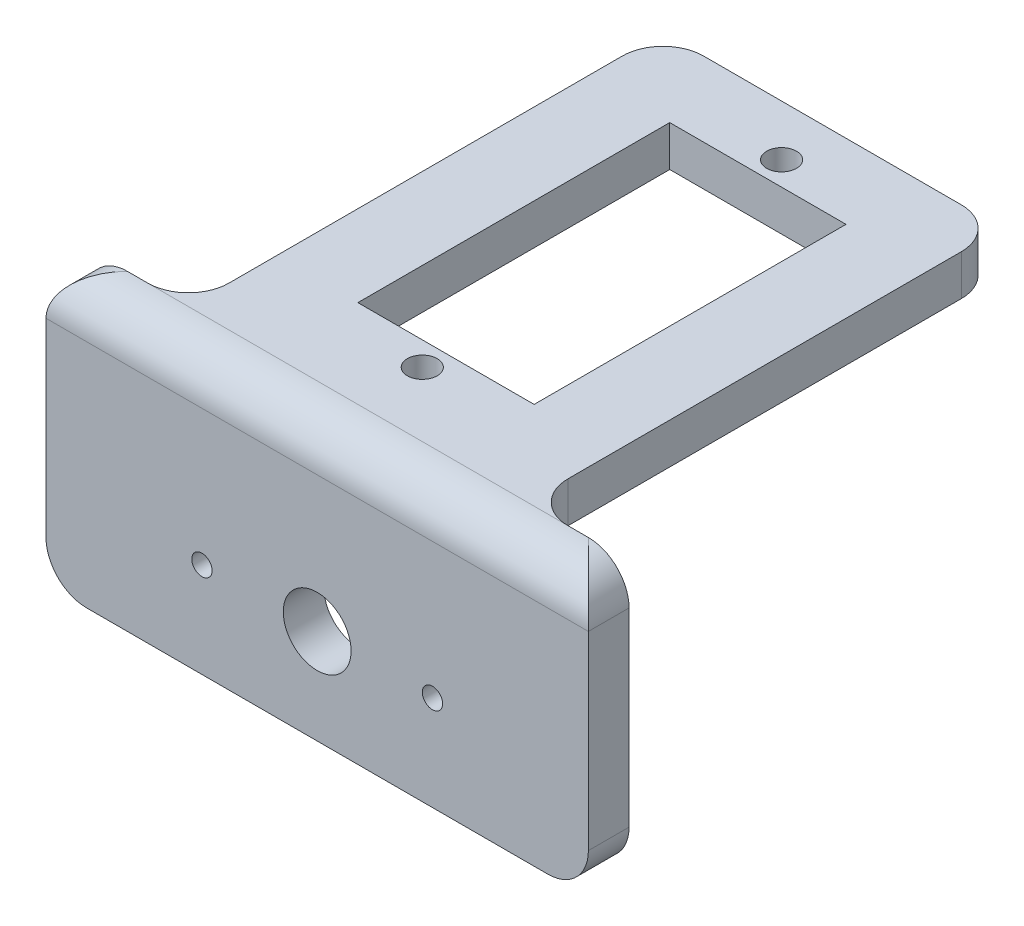
ISO-10303-21;
HEADER;
FILE_DESCRIPTION(('STEP AP214'),'2;1');
FILE_NAME('part.step','',(''),(''),'','','');
FILE_SCHEMA(('AUTOMOTIVE_DESIGN { 1 0 10303 214 1 1 1 1 }'));
ENDSEC;
DATA;
#1=APPLICATION_CONTEXT('core data for automotive mechanical design processes');
#2=APPLICATION_PROTOCOL_DEFINITION('international standard','automotive_design',2000,#1);
#3=PRODUCT_CONTEXT('',#1,'mechanical');
#4=PRODUCT('Part','Part','',(#3));
#5=PRODUCT_RELATED_PRODUCT_CATEGORY('part','',(#4));
#6=PRODUCT_DEFINITION_FORMATION('','',#4);
#7=PRODUCT_DEFINITION_CONTEXT('part definition',#1,'design');
#8=PRODUCT_DEFINITION('design','',#6,#7);
#9=PRODUCT_DEFINITION_SHAPE('','',#8);
#10=(LENGTH_UNIT() NAMED_UNIT(*) SI_UNIT(.MILLI.,.METRE.));
#11=(NAMED_UNIT(*) PLANE_ANGLE_UNIT() SI_UNIT($,.RADIAN.));
#12=(NAMED_UNIT(*) SI_UNIT($,.STERADIAN.) SOLID_ANGLE_UNIT());
#13=UNCERTAINTY_MEASURE_WITH_UNIT(LENGTH_MEASURE(1.E-05),#10,'distance_accuracy_value','');
#14=(GEOMETRIC_REPRESENTATION_CONTEXT(3) GLOBAL_UNCERTAINTY_ASSIGNED_CONTEXT((#13)) GLOBAL_UNIT_ASSIGNED_CONTEXT((#10,
#11,#12)) REPRESENTATION_CONTEXT('',''));
#15=CARTESIAN_POINT('',(0.,0.,0.));
#16=DIRECTION('',(0.,0.,1.));
#17=DIRECTION('',(1.,0.,0.));
#18=AXIS2_PLACEMENT_3D('',#15,#16,#17);
#19=CARTESIAN_POINT('',(0.,0.,-2.));
#20=DIRECTION('',(0.,0.,1.));
#21=DIRECTION('',(-1.,0.,0.));
#22=AXIS2_PLACEMENT_3D('',#19,#20,#21);
#23=PLANE('',#22);
#24=CARTESIAN_POINT('',(8.5,-4.99999999999999,-2.));
#25=DIRECTION('',(0.,0.,-1.));
#26=DIRECTION('',(-1.,0.,0.));
#27=AXIS2_PLACEMENT_3D('',#24,#25,#26);
#28=CIRCLE('',#27,0.75);
#29=CARTESIAN_POINT('',(7.75,-4.99999999999999,-2.));
#30=VERTEX_POINT('',#29);
#31=EDGE_CURVE('E206',#30,#30,#28,.F.);
#32=ORIENTED_EDGE('',*,*,#31,.T.);
#33=EDGE_LOOP('',(#32));
#34=FACE_BOUND('',#33,.T.);
#35=CARTESIAN_POINT('',(-8.5,-4.99999999999999,-2.));
#36=DIRECTION('',(0.,0.,-1.));
#37=DIRECTION('',(-1.,0.,0.));
#38=AXIS2_PLACEMENT_3D('',#35,#36,#37);
#39=CIRCLE('',#38,0.75);
#40=CARTESIAN_POINT('',(-9.25,-4.99999999999999,-2.));
#41=VERTEX_POINT('',#40);
#42=EDGE_CURVE('E238',#41,#41,#39,.T.);
#43=ORIENTED_EDGE('',*,*,#42,.F.);
#44=EDGE_LOOP('',(#43));
#45=FACE_BOUND('',#44,.T.);
#46=CARTESIAN_POINT('',(0.,-4.99999999999999,-2.));
#47=DIRECTION('',(0.,0.,-1.));
#48=DIRECTION('',(-1.,0.,0.));
#49=AXIS2_PLACEMENT_3D('',#46,#47,#48);
#50=CIRCLE('',#49,2.5);
#51=CARTESIAN_POINT('',(-2.5,-4.99999999999999,-2.));
#52=VERTEX_POINT('',#51);
#53=EDGE_CURVE('E237',#52,#52,#50,.T.);
#54=ORIENTED_EDGE('',*,*,#53,.F.);
#55=EDGE_LOOP('',(#54));
#56=FACE_BOUND('',#55,.T.);
#57=DIRECTION('',(0.,1.,0.));
#58=VECTOR('',#57,1.);
#59=CARTESIAN_POINT('',(20.,-12.,-2.));
#60=LINE('',#59,#58);
#61=CARTESIAN_POINT('',(20.,-8.99999999999999,-2.));
#62=VERTEX_POINT('',#61);
#63=CARTESIAN_POINT('',(20.,5.,-2.));
#64=VERTEX_POINT('',#63);
#65=EDGE_CURVE('E251',#62,#64,#60,.T.);
#66=ORIENTED_EDGE('',*,*,#65,.F.);
#67=CARTESIAN_POINT('',(17.,-8.99999999999999,-2.));
#68=DIRECTION('',(0.,0.,-1.));
#69=DIRECTION('',(-1.,0.,0.));
#70=AXIS2_PLACEMENT_3D('',#67,#68,#69);
#71=CIRCLE('',#70,3.);
#72=CARTESIAN_POINT('',(17.,-12.,-2.));
#73=VERTEX_POINT('',#72);
#74=EDGE_CURVE('E299',#73,#62,#71,.F.);
#75=ORIENTED_EDGE('',*,*,#74,.F.);
#76=DIRECTION('',(1.,0.,0.));
#77=VECTOR('',#76,1.);
#78=CARTESIAN_POINT('',(-20.,-12.,-2.));
#79=LINE('',#78,#77);
#80=CARTESIAN_POINT('',(-17.,-12.,-2.));
#81=VERTEX_POINT('',#80);
#82=EDGE_CURVE('E248',#81,#73,#79,.T.);
#83=ORIENTED_EDGE('',*,*,#82,.F.);
#84=CARTESIAN_POINT('',(-17.,-9.,-2.));
#85=DIRECTION('',(0.,0.,-1.));
#86=DIRECTION('',(-1.,0.,0.));
#87=AXIS2_PLACEMENT_3D('',#84,#85,#86);
#88=CIRCLE('',#87,3.);
#89=CARTESIAN_POINT('',(-20.,-9.,-2.));
#90=VERTEX_POINT('',#89);
#91=EDGE_CURVE('E296',#90,#81,#88,.F.);
#92=ORIENTED_EDGE('',*,*,#91,.F.);
#93=DIRECTION('',(0.,-1.,0.));
#94=VECTOR('',#93,1.);
#95=CARTESIAN_POINT('',(-20.,-12.,-2.));
#96=LINE('',#95,#94);
#97=CARTESIAN_POINT('',(-20.,5.,-2.));
#98=VERTEX_POINT('',#97);
#99=EDGE_CURVE('E241',#98,#90,#96,.T.);
#100=ORIENTED_EDGE('',*,*,#99,.F.);
#101=CARTESIAN_POINT('',(-17.,5.00000000000001,-2.));
#102=DIRECTION('',(0.,0.,-1.));
#103=DIRECTION('',(-1.,0.,0.));
#104=AXIS2_PLACEMENT_3D('',#101,#102,#103);
#105=CIRCLE('',#104,3.);
#106=CARTESIAN_POINT('',(-17.,8.00000000000001,-2.));
#107=VERTEX_POINT('',#106);
#108=EDGE_CURVE('E293',#107,#98,#105,.F.);
#109=ORIENTED_EDGE('',*,*,#108,.F.);
#110=DIRECTION('',(-1.,0.,0.));
#111=VECTOR('',#110,1.);
#112=CARTESIAN_POINT('',(-20.,8.00000000000001,-2.));
#113=LINE('',#112,#111);
#114=CARTESIAN_POINT('',(-15.5,8.00000000000001,-2.));
#115=VERTEX_POINT('',#114);
#116=EDGE_CURVE('E254',#115,#107,#113,.T.);
#117=ORIENTED_EDGE('',*,*,#116,.F.);
#118=DIRECTION('',(0.,-1.,0.));
#119=VECTOR('',#118,1.);
#120=CARTESIAN_POINT('',(-15.5,8.00000000000001,-2.));
#121=LINE('',#120,#119);
#122=CARTESIAN_POINT('',(-15.5,2.00000000000001,-2.));
#123=VERTEX_POINT('',#122);
#124=EDGE_CURVE('E285',#123,#115,#121,.F.);
#125=ORIENTED_EDGE('',*,*,#124,.F.);
#126=DIRECTION('',(1.,0.,0.));
#127=VECTOR('',#126,1.);
#128=CARTESIAN_POINT('',(-12.5,2.00000000000001,-2.));
#129=LINE('',#128,#127);
#130=CARTESIAN_POINT('',(15.5,2.00000000000001,-2.));
#131=VERTEX_POINT('',#130);
#132=EDGE_CURVE('E288',#131,#123,#129,.F.);
#133=ORIENTED_EDGE('',*,*,#132,.F.);
#134=DIRECTION('',(0.,-1.,0.));
#135=VECTOR('',#134,1.);
#136=CARTESIAN_POINT('',(15.5,0.,-2.));
#137=LINE('',#136,#135);
#138=CARTESIAN_POINT('',(15.5,8.00000000000001,-2.));
#139=VERTEX_POINT('',#138);
#140=EDGE_CURVE('E290',#139,#131,#137,.T.);
#141=ORIENTED_EDGE('',*,*,#140,.F.);
#142=CARTESIAN_POINT('',(17.,8.00000000000001,-2.));
#143=VERTEX_POINT('',#142);
#144=EDGE_CURVE('E255',#143,#139,#113,.T.);
#145=ORIENTED_EDGE('',*,*,#144,.F.);
#146=CARTESIAN_POINT('',(17.,5.00000000000001,-2.));
#147=DIRECTION('',(0.,0.,-1.));
#148=DIRECTION('',(-1.,0.,0.));
#149=AXIS2_PLACEMENT_3D('',#146,#147,#148);
#150=CIRCLE('',#149,3.);
#151=EDGE_CURVE('E302',#64,#143,#150,.F.);
#152=ORIENTED_EDGE('',*,*,#151,.F.);
#153=EDGE_LOOP('',(#66,#75,#83,#92,#100,#109,#117,#125,#133,#141,#145,#152));
#154=FACE_BOUND('',#153,.T.);
#155=ADVANCED_FACE('F36',(#34,#45,#56,#154),#23,.F.);
#156=CARTESIAN_POINT('',(0.,-12.,1.));
#157=DIRECTION('',(0.,-1.,0.));
#158=DIRECTION('',(1.,0.,0.));
#159=AXIS2_PLACEMENT_3D('',#156,#157,#158);
#160=PLANE('',#159);
#161=DIRECTION('',(1.,0.,0.));
#162=VECTOR('',#161,1.);
#163=CARTESIAN_POINT('',(0.,-12.,1.));
#164=LINE('',#163,#162);
#165=CARTESIAN_POINT('',(-17.,-12.,1.));
#166=VERTEX_POINT('',#165);
#167=CARTESIAN_POINT('',(17.,-12.,1.));
#168=VERTEX_POINT('',#167);
#169=EDGE_CURVE('E258',#166,#168,#164,.T.);
#170=ORIENTED_EDGE('',*,*,#169,.F.);
#171=DIRECTION('',(0.,0.,-1.));
#172=VECTOR('',#171,1.);
#173=CARTESIAN_POINT('',(-17.,-12.,1.));
#174=LINE('',#173,#172);
#175=EDGE_CURVE('E305',#81,#166,#174,.F.);
#176=ORIENTED_EDGE('',*,*,#175,.F.);
#177=ORIENTED_EDGE('',*,*,#82,.T.);
#178=DIRECTION('',(0.,0.,-1.));
#179=VECTOR('',#178,1.);
#180=CARTESIAN_POINT('',(17.,-12.,1.));
#181=LINE('',#180,#179);
#182=EDGE_CURVE('E308',#168,#73,#181,.T.);
#183=ORIENTED_EDGE('',*,*,#182,.F.);
#184=EDGE_LOOP('',(#170,#176,#177,#183));
#185=FACE_BOUND('',#184,.T.);
#186=ADVANCED_FACE('F415',(#185),#160,.T.);
#187=CARTESIAN_POINT('',(-20.,0.,1.));
#188=DIRECTION('',(1.,0.,0.));
#189=DIRECTION('',(0.,0.,1.));
#190=AXIS2_PLACEMENT_3D('',#187,#188,#189);
#191=PLANE('',#190);
#192=DIRECTION('',(0.,1.,0.));
#193=VECTOR('',#192,1.);
#194=CARTESIAN_POINT('',(-20.,0.,1.));
#195=LINE('',#194,#193);
#196=CARTESIAN_POINT('',(-20.,-9.,1.));
#197=VERTEX_POINT('',#196);
#198=CARTESIAN_POINT('',(-20.,5.00000000000001,1.));
#199=VERTEX_POINT('',#198);
#200=EDGE_CURVE('E264',#197,#199,#195,.T.);
#201=ORIENTED_EDGE('',*,*,#200,.T.);
#202=DIRECTION('',(0.,0.,-1.));
#203=VECTOR('',#202,1.);
#204=CARTESIAN_POINT('',(-20.,5.00000000000001,1.));
#205=LINE('',#204,#203);
#206=EDGE_CURVE('E310',#98,#199,#205,.F.);
#207=ORIENTED_EDGE('',*,*,#206,.F.);
#208=ORIENTED_EDGE('',*,*,#99,.T.);
#209=DIRECTION('',(0.,0.,-1.));
#210=VECTOR('',#209,1.);
#211=CARTESIAN_POINT('',(-20.,-9.,-2.));
#212=LINE('',#211,#210);
#213=EDGE_CURVE('E313',#197,#90,#212,.T.);
#214=ORIENTED_EDGE('',*,*,#213,.F.);
#215=EDGE_LOOP('',(#201,#207,#208,#214));
#216=FACE_BOUND('',#215,.T.);
#217=ADVANCED_FACE('F402',(#216),#191,.F.);
#218=CARTESIAN_POINT('',(0.,8.00000000000001,1.));
#219=DIRECTION('',(0.,-1.,0.));
#220=DIRECTION('',(0.,0.,1.));
#221=AXIS2_PLACEMENT_3D('',#218,#219,#220);
#222=PLANE('',#221);
#223=CARTESIAN_POINT('',(15.5,8.00000000000001,-5.));
#224=DIRECTION('',(0.,1.,0.));
#225=DIRECTION('',(0.,0.,1.));
#226=AXIS2_PLACEMENT_3D('',#223,#224,#225);
#227=CIRCLE('',#226,3.);
#228=CARTESIAN_POINT('',(12.5,8.00000000000001,-5.));
#229=VERTEX_POINT('',#228);
#230=EDGE_CURVE('E335',#229,#139,#227,.T.);
#231=ORIENTED_EDGE('',*,*,#230,.F.);
#232=DIRECTION('',(0.,0.,1.));
#233=VECTOR('',#232,1.);
#234=CARTESIAN_POINT('',(12.5,8.00000000000001,0.));
#235=LINE('',#234,#233);
#236=CARTESIAN_POINT('',(12.5,8.00000000000001,-34.));
#237=VERTEX_POINT('',#236);
#238=EDGE_CURVE('E209',#237,#229,#235,.T.);
#239=ORIENTED_EDGE('',*,*,#238,.F.);
#240=CARTESIAN_POINT('',(9.49999999999999,8.00000000000001,-34.));
#241=DIRECTION('',(0.,1.,0.));
#242=DIRECTION('',(0.,0.,1.));
#243=AXIS2_PLACEMENT_3D('',#240,#241,#242);
#244=CIRCLE('',#243,3.);
#245=CARTESIAN_POINT('',(9.49999999999999,8.00000000000001,-37.));
#246=VERTEX_POINT('',#245);
#247=EDGE_CURVE('E277',#246,#237,#244,.F.);
#248=ORIENTED_EDGE('',*,*,#247,.F.);
#249=DIRECTION('',(-1.,0.,0.));
#250=VECTOR('',#249,1.);
#251=CARTESIAN_POINT('',(0.,8.00000000000001,-37.));
#252=LINE('',#251,#250);
#253=CARTESIAN_POINT('',(-9.49999999999999,8.00000000000001,-37.));
#254=VERTEX_POINT('',#253);
#255=EDGE_CURVE('E205',#246,#254,#252,.T.);
#256=ORIENTED_EDGE('',*,*,#255,.T.);
#257=CARTESIAN_POINT('',(-9.49999999999999,8.00000000000001,-34.));
#258=DIRECTION('',(0.,1.,0.));
#259=DIRECTION('',(0.,0.,1.));
#260=AXIS2_PLACEMENT_3D('',#257,#258,#259);
#261=CIRCLE('',#260,3.);
#262=CARTESIAN_POINT('',(-12.5,8.00000000000001,-34.));
#263=VERTEX_POINT('',#262);
#264=EDGE_CURVE('E274',#263,#254,#261,.F.);
#265=ORIENTED_EDGE('',*,*,#264,.F.);
#266=DIRECTION('',(0.,0.,1.));
#267=VECTOR('',#266,1.);
#268=CARTESIAN_POINT('',(-12.5,8.00000000000001,0.));
#269=LINE('',#268,#267);
#270=CARTESIAN_POINT('',(-12.5,8.00000000000001,-5.));
#271=VERTEX_POINT('',#270);
#272=EDGE_CURVE('E202',#263,#271,#269,.T.);
#273=ORIENTED_EDGE('',*,*,#272,.T.);
#274=CARTESIAN_POINT('',(-15.5,8.00000000000001,-5.));
#275=DIRECTION('',(0.,1.,0.));
#276=DIRECTION('',(0.,0.,1.));
#277=AXIS2_PLACEMENT_3D('',#274,#275,#276);
#278=CIRCLE('',#277,3.);
#279=EDGE_CURVE('E45',#115,#271,#278,.T.);
#280=ORIENTED_EDGE('',*,*,#279,.F.);
#281=DIRECTION('',(1.,0.,0.));
#282=VECTOR('',#281,1.);
#283=CARTESIAN_POINT('',(0.,8.00000000000001,-2.));
#284=LINE('',#283,#282);
#285=EDGE_CURVE('E11',#139,#115,#284,.F.);
#286=ORIENTED_EDGE('',*,*,#285,.F.);
#287=EDGE_LOOP('',(#231,#239,#248,#256,#265,#273,#280,#286));
#288=FACE_BOUND('',#287,.T.);
#289=DIRECTION('',(-1.,0.,0.));
#290=VECTOR('',#289,1.);
#291=CARTESIAN_POINT('',(0.,8.00000000000001,-31.5));
#292=LINE('',#291,#290);
#293=CARTESIAN_POINT('',(6.5,8.00000000000001,-31.5));
#294=VERTEX_POINT('',#293);
#295=CARTESIAN_POINT('',(-6.5,8.00000000000001,-31.5));
#296=VERTEX_POINT('',#295);
#297=EDGE_CURVE('E174',#294,#296,#292,.T.);
#298=ORIENTED_EDGE('',*,*,#297,.F.);
#299=DIRECTION('',(0.,0.,1.));
#300=VECTOR('',#299,1.);
#301=CARTESIAN_POINT('',(6.5,8.00000000000001,0.));
#302=LINE('',#301,#300);
#303=CARTESIAN_POINT('',(6.5,8.00000000000001,-8.50000000000001));
#304=VERTEX_POINT('',#303);
#305=EDGE_CURVE('E224',#294,#304,#302,.T.);
#306=ORIENTED_EDGE('',*,*,#305,.T.);
#307=DIRECTION('',(-1.,0.,0.));
#308=VECTOR('',#307,1.);
#309=CARTESIAN_POINT('',(0.,8.00000000000001,-8.50000000000001));
#310=LINE('',#309,#308);
#311=CARTESIAN_POINT('',(-6.5,8.00000000000001,-8.50000000000001));
#312=VERTEX_POINT('',#311);
#313=EDGE_CURVE('E221',#304,#312,#310,.T.);
#314=ORIENTED_EDGE('',*,*,#313,.T.);
#315=DIRECTION('',(0.,0.,1.));
#316=VECTOR('',#315,1.);
#317=CARTESIAN_POINT('',(-6.5,8.00000000000001,0.));
#318=LINE('',#317,#316);
#319=EDGE_CURVE('E219',#296,#312,#318,.T.);
#320=ORIENTED_EDGE('',*,*,#319,.F.);
#321=EDGE_LOOP('',(#298,#306,#314,#320));
#322=FACE_BOUND('',#321,.T.);
#323=CARTESIAN_POINT('',(0.,8.00000000000001,-6.75000000000001));
#324=DIRECTION('',(0.,-1.,0.));
#325=DIRECTION('',(-1.,0.,0.));
#326=AXIS2_PLACEMENT_3D('',#323,#324,#325);
#327=CIRCLE('',#326,1.1);
#328=CARTESIAN_POINT('',(-1.1,8.00000000000001,-6.75000000000001));
#329=VERTEX_POINT('',#328);
#330=EDGE_CURVE('E215',#329,#329,#327,.T.);
#331=ORIENTED_EDGE('',*,*,#330,.T.);
#332=EDGE_LOOP('',(#331));
#333=FACE_BOUND('',#332,.T.);
#334=CARTESIAN_POINT('',(0.,8.00000000000001,-33.25));
#335=DIRECTION('',(0.,-1.,0.));
#336=DIRECTION('',(-1.,0.,0.));
#337=AXIS2_PLACEMENT_3D('',#334,#335,#336);
#338=CIRCLE('',#337,1.1);
#339=CARTESIAN_POINT('',(-1.1,8.00000000000001,-33.25));
#340=VERTEX_POINT('',#339);
#341=EDGE_CURVE('E212',#340,#340,#338,.T.);
#342=ORIENTED_EDGE('',*,*,#341,.T.);
#343=EDGE_LOOP('',(#342));
#344=FACE_BOUND('',#343,.T.);
#345=ADVANCED_FACE('F364',(#288,#322,#333,#344),#222,.F.);
#346=CARTESIAN_POINT('',(20.,0.,1.));
#347=DIRECTION('',(1.,0.,0.));
#348=DIRECTION('',(0.,1.,0.));
#349=AXIS2_PLACEMENT_3D('',#346,#347,#348);
#350=PLANE('',#349);
#351=DIRECTION('',(0.,1.,0.));
#352=VECTOR('',#351,1.);
#353=CARTESIAN_POINT('',(20.,0.,1.));
#354=LINE('',#353,#352);
#355=CARTESIAN_POINT('',(20.,-8.99999999999999,1.));
#356=VERTEX_POINT('',#355);
#357=CARTESIAN_POINT('',(20.,5.00000000000001,1.));
#358=VERTEX_POINT('',#357);
#359=EDGE_CURVE('E261',#356,#358,#354,.T.);
#360=ORIENTED_EDGE('',*,*,#359,.F.);
#361=DIRECTION('',(0.,0.,-1.));
#362=VECTOR('',#361,1.);
#363=CARTESIAN_POINT('',(20.,-8.99999999999999,1.));
#364=LINE('',#363,#362);
#365=EDGE_CURVE('E280',#62,#356,#364,.F.);
#366=ORIENTED_EDGE('',*,*,#365,.F.);
#367=ORIENTED_EDGE('',*,*,#65,.T.);
#368=DIRECTION('',(0.,0.,-1.));
#369=VECTOR('',#368,1.);
#370=CARTESIAN_POINT('',(20.,5.00000000000001,-2.));
#371=LINE('',#370,#369);
#372=EDGE_CURVE('E283',#358,#64,#371,.T.);
#373=ORIENTED_EDGE('',*,*,#372,.F.);
#374=EDGE_LOOP('',(#360,#366,#367,#373));
#375=FACE_BOUND('',#374,.T.);
#376=ADVANCED_FACE('F401',(#375),#350,.T.);
#377=CARTESIAN_POINT('',(0.,0.,1.));
#378=DIRECTION('',(0.,0.,-1.));
#379=DIRECTION('',(1.,0.,0.));
#380=AXIS2_PLACEMENT_3D('',#377,#378,#379);
#381=PLANE('',#380);
#382=CARTESIAN_POINT('',(8.5,-4.99999999999999,1.));
#383=DIRECTION('',(0.,0.,1.));
#384=DIRECTION('',(1.,0.,0.));
#385=AXIS2_PLACEMENT_3D('',#382,#383,#384);
#386=CIRCLE('',#385,0.75);
#387=CARTESIAN_POINT('',(9.25,-4.99999999999999,1.));
#388=VERTEX_POINT('',#387);
#389=EDGE_CURVE('E343',#388,#388,#386,.T.);
#390=ORIENTED_EDGE('',*,*,#389,.F.);
#391=EDGE_LOOP('',(#390));
#392=FACE_BOUND('',#391,.T.);
#393=ORIENTED_EDGE('',*,*,#200,.F.);
#394=CARTESIAN_POINT('',(-17.,-9.,1.));
#395=DIRECTION('',(0.,0.,1.));
#396=DIRECTION('',(1.,0.,0.));
#397=AXIS2_PLACEMENT_3D('',#394,#395,#396);
#398=CIRCLE('',#397,3.);
#399=EDGE_CURVE('E267',#166,#197,#398,.F.);
#400=ORIENTED_EDGE('',*,*,#399,.F.);
#401=ORIENTED_EDGE('',*,*,#169,.T.);
#402=CARTESIAN_POINT('',(17.,-8.99999999999999,1.));
#403=DIRECTION('',(0.,0.,1.));
#404=DIRECTION('',(1.,0.,0.));
#405=AXIS2_PLACEMENT_3D('',#402,#403,#404);
#406=CIRCLE('',#405,3.);
#407=EDGE_CURVE('E269',#356,#168,#406,.F.);
#408=ORIENTED_EDGE('',*,*,#407,.F.);
#409=ORIENTED_EDGE('',*,*,#359,.T.);
#410=DIRECTION('',(1.,0.,0.));
#411=VECTOR('',#410,1.);
#412=CARTESIAN_POINT('',(0.,5.00000000000001,1.));
#413=LINE('',#412,#411);
#414=EDGE_CURVE('E271',#199,#358,#413,.T.);
#415=ORIENTED_EDGE('',*,*,#414,.F.);
#416=EDGE_LOOP('',(#393,#400,#401,#408,#409,#415));
#417=FACE_BOUND('',#416,.T.);
#418=CARTESIAN_POINT('',(-8.5,-4.99999999999999,1.));
#419=DIRECTION('',(0.,0.,1.));
#420=DIRECTION('',(1.,0.,0.));
#421=AXIS2_PLACEMENT_3D('',#418,#419,#420);
#422=CIRCLE('',#421,0.75);
#423=CARTESIAN_POINT('',(-7.75,-4.99999999999999,1.));
#424=VERTEX_POINT('',#423);
#425=EDGE_CURVE('E230',#424,#424,#422,.F.);
#426=ORIENTED_EDGE('',*,*,#425,.T.);
#427=EDGE_LOOP('',(#426));
#428=FACE_BOUND('',#427,.T.);
#429=CARTESIAN_POINT('',(0.,-4.99999999999999,1.));
#430=DIRECTION('',(0.,0.,1.));
#431=DIRECTION('',(1.,0.,0.));
#432=AXIS2_PLACEMENT_3D('',#429,#430,#431);
#433=CIRCLE('',#432,2.5);
#434=CARTESIAN_POINT('',(2.5,-4.99999999999999,1.));
#435=VERTEX_POINT('',#434);
#436=EDGE_CURVE('E234',#435,#435,#433,.F.);
#437=ORIENTED_EDGE('',*,*,#436,.T.);
#438=EDGE_LOOP('',(#437));
#439=FACE_BOUND('',#438,.T.);
#440=ADVANCED_FACE('F429',(#392,#417,#428,#439),#381,.F.);
#441=CARTESIAN_POINT('',(-8.5,-4.99999999999999,-9.07106781186548));
#442=DIRECTION('',(0.,0.,1.));
#443=DIRECTION('',(-1.,0.,0.));
#444=AXIS2_PLACEMENT_3D('',#441,#442,#443);
#445=CYLINDRICAL_SURFACE('',#444,0.75);
#446=ORIENTED_EDGE('',*,*,#42,.T.);
#447=EDGE_LOOP('',(#446));
#448=FACE_BOUND('',#447,.T.);
#449=ORIENTED_EDGE('',*,*,#425,.F.);
#450=EDGE_LOOP('',(#449));
#451=FACE_BOUND('',#450,.T.);
#452=ADVANCED_FACE('F427',(#448,#451),#445,.F.);
#453=CARTESIAN_POINT('',(0.,-4.99999999999999,-9.07106781186548));
#454=DIRECTION('',(0.,0.,1.));
#455=DIRECTION('',(-1.,0.,0.));
#456=AXIS2_PLACEMENT_3D('',#453,#454,#455);
#457=CYLINDRICAL_SURFACE('',#456,2.5);
#458=ORIENTED_EDGE('',*,*,#53,.T.);
#459=EDGE_LOOP('',(#458));
#460=FACE_BOUND('',#459,.T.);
#461=ORIENTED_EDGE('',*,*,#436,.F.);
#462=EDGE_LOOP('',(#461));
#463=FACE_BOUND('',#462,.T.);
#464=ADVANCED_FACE('F581',(#460,#463),#457,.F.);
#465=CARTESIAN_POINT('',(-12.5,5.00000000000001,0.));
#466=DIRECTION('',(1.,0.,0.));
#467=DIRECTION('',(0.,1.,0.));
#468=AXIS2_PLACEMENT_3D('',#465,#466,#467);
#469=PLANE('',#468);
#470=DIRECTION('',(0.,0.,1.));
#471=VECTOR('',#470,1.);
#472=CARTESIAN_POINT('',(-12.5,5.00000000000001,0.));
#473=LINE('',#472,#471);
#474=CARTESIAN_POINT('',(-12.5,5.00000000000001,-34.));
#475=VERTEX_POINT('',#474);
#476=CARTESIAN_POINT('',(-12.5,5.00000000000001,-5.));
#477=VERTEX_POINT('',#476);
#478=EDGE_CURVE('E227',#475,#477,#473,.T.);
#479=ORIENTED_EDGE('',*,*,#478,.T.);
#480=DIRECTION('',(0.,-1.,0.));
#481=VECTOR('',#480,1.);
#482=CARTESIAN_POINT('',(-12.5,5.00000000000001,-5.));
#483=LINE('',#482,#481);
#484=EDGE_CURVE('E330',#271,#477,#483,.T.);
#485=ORIENTED_EDGE('',*,*,#484,.F.);
#486=ORIENTED_EDGE('',*,*,#272,.F.);
#487=DIRECTION('',(0.,1.,0.));
#488=VECTOR('',#487,1.);
#489=CARTESIAN_POINT('',(-12.5,5.00000000000001,-34.));
#490=LINE('',#489,#488);
#491=EDGE_CURVE('E333',#475,#263,#490,.T.);
#492=ORIENTED_EDGE('',*,*,#491,.F.);
#493=EDGE_LOOP('',(#479,#485,#486,#492));
#494=FACE_BOUND('',#493,.T.);
#495=ADVANCED_FACE('F369',(#494),#469,.F.);
#496=CARTESIAN_POINT('',(12.5,5.00000000000001,0.));
#497=DIRECTION('',(1.,0.,0.));
#498=DIRECTION('',(0.,1.,0.));
#499=AXIS2_PLACEMENT_3D('',#496,#497,#498);
#500=PLANE('',#499);
#501=ORIENTED_EDGE('',*,*,#238,.T.);
#502=DIRECTION('',(0.,-1.,0.));
#503=VECTOR('',#502,1.);
#504=CARTESIAN_POINT('',(12.5,5.00000000000001,-5.));
#505=LINE('',#504,#503);
#506=CARTESIAN_POINT('',(12.5,5.00000000000001,-5.));
#507=VERTEX_POINT('',#506);
#508=EDGE_CURVE('E319',#507,#229,#505,.F.);
#509=ORIENTED_EDGE('',*,*,#508,.F.);
#510=DIRECTION('',(0.,0.,1.));
#511=VECTOR('',#510,1.);
#512=CARTESIAN_POINT('',(12.5,5.00000000000001,0.));
#513=LINE('',#512,#511);
#514=CARTESIAN_POINT('',(12.5,5.00000000000001,-34.));
#515=VERTEX_POINT('',#514);
#516=EDGE_CURVE('E374',#515,#507,#513,.T.);
#517=ORIENTED_EDGE('',*,*,#516,.F.);
#518=DIRECTION('',(0.,1.,0.));
#519=VECTOR('',#518,1.);
#520=CARTESIAN_POINT('',(12.5,5.00000000000001,-34.));
#521=LINE('',#520,#519);
#522=EDGE_CURVE('E321',#237,#515,#521,.F.);
#523=ORIENTED_EDGE('',*,*,#522,.F.);
#524=EDGE_LOOP('',(#501,#509,#517,#523));
#525=FACE_BOUND('',#524,.T.);
#526=ADVANCED_FACE('F388',(#525),#500,.T.);
#527=CARTESIAN_POINT('',(0.,5.00000000000001,0.));
#528=DIRECTION('',(0.,1.,0.));
#529=DIRECTION('',(-1.,0.,0.));
#530=AXIS2_PLACEMENT_3D('',#527,#528,#529);
#531=PLANE('',#530);
#532=CARTESIAN_POINT('',(0.,5.00000000000001,-33.25));
#533=DIRECTION('',(0.,-1.,0.));
#534=DIRECTION('',(-1.,0.,0.));
#535=AXIS2_PLACEMENT_3D('',#532,#533,#534);
#536=CIRCLE('',#535,1.1);
#537=CARTESIAN_POINT('',(-1.1,5.00000000000001,-33.25));
#538=VERTEX_POINT('',#537);
#539=EDGE_CURVE('E196',#538,#538,#536,.T.);
#540=ORIENTED_EDGE('',*,*,#539,.F.);
#541=EDGE_LOOP('',(#540));
#542=FACE_BOUND('',#541,.T.);
#543=CARTESIAN_POINT('',(0.,5.00000000000001,-6.75000000000001));
#544=DIRECTION('',(0.,-1.,0.));
#545=DIRECTION('',(-1.,0.,0.));
#546=AXIS2_PLACEMENT_3D('',#543,#544,#545);
#547=CIRCLE('',#546,1.1);
#548=CARTESIAN_POINT('',(-1.1,5.00000000000001,-6.75000000000001));
#549=VERTEX_POINT('',#548);
#550=EDGE_CURVE('E193',#549,#549,#547,.T.);
#551=ORIENTED_EDGE('',*,*,#550,.F.);
#552=EDGE_LOOP('',(#551));
#553=FACE_BOUND('',#552,.T.);
#554=DIRECTION('',(-1.,0.,0.));
#555=VECTOR('',#554,1.);
#556=CARTESIAN_POINT('',(0.,5.00000000000001,-31.5));
#557=LINE('',#556,#555);
#558=CARTESIAN_POINT('',(6.5,5.00000000000001,-31.5));
#559=VERTEX_POINT('',#558);
#560=CARTESIAN_POINT('',(-6.5,5.00000000000001,-31.5));
#561=VERTEX_POINT('',#560);
#562=EDGE_CURVE('E172',#559,#561,#557,.T.);
#563=ORIENTED_EDGE('',*,*,#562,.T.);
#564=DIRECTION('',(0.,0.,1.));
#565=VECTOR('',#564,1.);
#566=CARTESIAN_POINT('',(-6.5,5.00000000000001,0.));
#567=LINE('',#566,#565);
#568=CARTESIAN_POINT('',(-6.5,5.00000000000001,-8.50000000000001));
#569=VERTEX_POINT('',#568);
#570=EDGE_CURVE('E182',#561,#569,#567,.T.);
#571=ORIENTED_EDGE('',*,*,#570,.T.);
#572=DIRECTION('',(-1.,0.,0.));
#573=VECTOR('',#572,1.);
#574=CARTESIAN_POINT('',(0.,5.00000000000001,-8.50000000000001));
#575=LINE('',#574,#573);
#576=CARTESIAN_POINT('',(6.5,5.00000000000001,-8.50000000000001));
#577=VERTEX_POINT('',#576);
#578=EDGE_CURVE('E187',#577,#569,#575,.T.);
#579=ORIENTED_EDGE('',*,*,#578,.F.);
#580=DIRECTION('',(0.,0.,1.));
#581=VECTOR('',#580,1.);
#582=CARTESIAN_POINT('',(6.5,5.00000000000001,0.));
#583=LINE('',#582,#581);
#584=EDGE_CURVE('E179',#559,#577,#583,.T.);
#585=ORIENTED_EDGE('',*,*,#584,.F.);
#586=EDGE_LOOP('',(#563,#571,#579,#585));
#587=FACE_BOUND('',#586,.T.);
#588=ORIENTED_EDGE('',*,*,#516,.T.);
#589=DIRECTION('',(1.,0.,0.));
#590=VECTOR('',#589,1.);
#591=CARTESIAN_POINT('',(12.5,5.00000000000001,-5.));
#592=LINE('',#591,#590);
#593=EDGE_CURVE('E324',#477,#507,#592,.T.);
#594=ORIENTED_EDGE('',*,*,#593,.F.);
#595=ORIENTED_EDGE('',*,*,#478,.F.);
#596=CARTESIAN_POINT('',(-9.49999999999999,5.00000000000001,-34.));
#597=DIRECTION('',(0.,-1.,0.));
#598=DIRECTION('',(-1.,0.,0.));
#599=AXIS2_PLACEMENT_3D('',#596,#597,#598);
#600=CIRCLE('',#599,3.);
#601=CARTESIAN_POINT('',(-9.49999999999999,5.00000000000001,-37.));
#602=VERTEX_POINT('',#601);
#603=EDGE_CURVE('E60',#602,#475,#600,.F.);
#604=ORIENTED_EDGE('',*,*,#603,.F.);
#605=DIRECTION('',(-1.,0.,0.));
#606=VECTOR('',#605,1.);
#607=CARTESIAN_POINT('',(0.,5.00000000000001,-37.));
#608=LINE('',#607,#606);
#609=CARTESIAN_POINT('',(9.49999999999999,5.00000000000001,-37.));
#610=VERTEX_POINT('',#609);
#611=EDGE_CURVE('E371',#610,#602,#608,.T.);
#612=ORIENTED_EDGE('',*,*,#611,.F.);
#613=CARTESIAN_POINT('',(9.49999999999999,5.00000000000001,-34.));
#614=DIRECTION('',(0.,-1.,0.));
#615=DIRECTION('',(-1.,0.,0.));
#616=AXIS2_PLACEMENT_3D('',#613,#614,#615);
#617=CIRCLE('',#616,3.);
#618=EDGE_CURVE('E327',#515,#610,#617,.F.);
#619=ORIENTED_EDGE('',*,*,#618,.F.);
#620=EDGE_LOOP('',(#588,#594,#595,#604,#612,#619));
#621=FACE_BOUND('',#620,.T.);
#622=ADVANCED_FACE('F190',(#542,#553,#587,#621),#531,.F.);
#623=CARTESIAN_POINT('',(0.,5.00000000000001,-31.5));
#624=DIRECTION('',(0.,0.,1.));
#625=DIRECTION('',(-1.,0.,0.));
#626=AXIS2_PLACEMENT_3D('',#623,#624,#625);
#627=PLANE('',#626);
#628=ORIENTED_EDGE('',*,*,#297,.T.);
#629=DIRECTION('',(0.,1.,0.));
#630=VECTOR('',#629,1.);
#631=CARTESIAN_POINT('',(-6.5,5.00000000000001,-31.5));
#632=LINE('',#631,#630);
#633=EDGE_CURVE('E168',#561,#296,#632,.T.);
#634=ORIENTED_EDGE('',*,*,#633,.F.);
#635=ORIENTED_EDGE('',*,*,#562,.F.);
#636=DIRECTION('',(0.,1.,0.));
#637=VECTOR('',#636,1.);
#638=CARTESIAN_POINT('',(6.5,5.00000000000001,-31.5));
#639=LINE('',#638,#637);
#640=EDGE_CURVE('E228',#559,#294,#639,.T.);
#641=ORIENTED_EDGE('',*,*,#640,.T.);
#642=EDGE_LOOP('',(#628,#634,#635,#641));
#643=FACE_BOUND('',#642,.T.);
#644=ADVANCED_FACE('F170',(#643),#627,.T.);
#645=CARTESIAN_POINT('',(6.5,5.00000000000001,0.));
#646=DIRECTION('',(1.,0.,0.));
#647=DIRECTION('',(0.,1.,0.));
#648=AXIS2_PLACEMENT_3D('',#645,#646,#647);
#649=PLANE('',#648);
#650=ORIENTED_EDGE('',*,*,#305,.F.);
#651=ORIENTED_EDGE('',*,*,#640,.F.);
#652=ORIENTED_EDGE('',*,*,#584,.T.);
#653=DIRECTION('',(0.,1.,0.));
#654=VECTOR('',#653,1.);
#655=CARTESIAN_POINT('',(6.5,5.00000000000001,-8.50000000000001));
#656=LINE('',#655,#654);
#657=EDGE_CURVE('E231',#577,#304,#656,.T.);
#658=ORIENTED_EDGE('',*,*,#657,.T.);
#659=EDGE_LOOP('',(#650,#651,#652,#658));
#660=FACE_BOUND('',#659,.T.);
#661=ADVANCED_FACE('F541',(#660),#649,.F.);
#662=CARTESIAN_POINT('',(0.,5.00000000000001,-8.50000000000001));
#663=DIRECTION('',(0.,0.,1.));
#664=DIRECTION('',(-1.,0.,0.));
#665=AXIS2_PLACEMENT_3D('',#662,#663,#664);
#666=PLANE('',#665);
#667=ORIENTED_EDGE('',*,*,#313,.F.);
#668=ORIENTED_EDGE('',*,*,#657,.F.);
#669=ORIENTED_EDGE('',*,*,#578,.T.);
#670=DIRECTION('',(0.,1.,0.));
#671=VECTOR('',#670,1.);
#672=CARTESIAN_POINT('',(-6.5,5.00000000000001,-8.50000000000001));
#673=LINE('',#672,#671);
#674=EDGE_CURVE('E178',#569,#312,#673,.T.);
#675=ORIENTED_EDGE('',*,*,#674,.T.);
#676=EDGE_LOOP('',(#667,#668,#669,#675));
#677=FACE_BOUND('',#676,.T.);
#678=ADVANCED_FACE('F395',(#677),#666,.F.);
#679=CARTESIAN_POINT('',(0.,5.00000000000001,-6.75000000000001));
#680=DIRECTION('',(0.,1.,0.));
#681=DIRECTION('',(-1.,0.,0.));
#682=AXIS2_PLACEMENT_3D('',#679,#680,#681);
#683=CYLINDRICAL_SURFACE('',#682,1.1);
#684=ORIENTED_EDGE('',*,*,#550,.T.);
#685=EDGE_LOOP('',(#684));
#686=FACE_BOUND('',#685,.T.);
#687=ORIENTED_EDGE('',*,*,#330,.F.);
#688=EDGE_LOOP('',(#687));
#689=FACE_BOUND('',#688,.T.);
#690=ADVANCED_FACE('F392',(#686,#689),#683,.F.);
#691=CARTESIAN_POINT('',(0.,5.00000000000001,-33.25));
#692=DIRECTION('',(0.,1.,0.));
#693=DIRECTION('',(-1.,0.,0.));
#694=AXIS2_PLACEMENT_3D('',#691,#692,#693);
#695=CYLINDRICAL_SURFACE('',#694,1.1);
#696=ORIENTED_EDGE('',*,*,#539,.T.);
#697=EDGE_LOOP('',(#696));
#698=FACE_BOUND('',#697,.T.);
#699=ORIENTED_EDGE('',*,*,#341,.F.);
#700=EDGE_LOOP('',(#699));
#701=FACE_BOUND('',#700,.T.);
#702=ADVANCED_FACE('F383',(#698,#701),#695,.F.);
#703=CARTESIAN_POINT('',(0.,5.00000000000001,-37.));
#704=DIRECTION('',(0.,0.,1.));
#705=DIRECTION('',(-1.,0.,0.));
#706=AXIS2_PLACEMENT_3D('',#703,#704,#705);
#707=PLANE('',#706);
#708=ORIENTED_EDGE('',*,*,#611,.T.);
#709=DIRECTION('',(0.,1.,0.));
#710=VECTOR('',#709,1.);
#711=CARTESIAN_POINT('',(-9.49999999999999,5.00000000000001,-37.));
#712=LINE('',#711,#710);
#713=EDGE_CURVE('E315',#254,#602,#712,.F.);
#714=ORIENTED_EDGE('',*,*,#713,.F.);
#715=ORIENTED_EDGE('',*,*,#255,.F.);
#716=DIRECTION('',(0.,1.,0.));
#717=VECTOR('',#716,1.);
#718=CARTESIAN_POINT('',(9.49999999999999,8.00000000000001,-37.));
#719=LINE('',#718,#717);
#720=EDGE_CURVE('E317',#610,#246,#719,.T.);
#721=ORIENTED_EDGE('',*,*,#720,.F.);
#722=EDGE_LOOP('',(#708,#714,#715,#721));
#723=FACE_BOUND('',#722,.T.);
#724=ADVANCED_FACE('F406',(#723),#707,.F.);
#725=CARTESIAN_POINT('',(-6.5,5.00000000000001,0.));
#726=DIRECTION('',(1.,0.,0.));
#727=DIRECTION('',(0.,1.,0.));
#728=AXIS2_PLACEMENT_3D('',#725,#726,#727);
#729=PLANE('',#728);
#730=ORIENTED_EDGE('',*,*,#319,.T.);
#731=ORIENTED_EDGE('',*,*,#674,.F.);
#732=ORIENTED_EDGE('',*,*,#570,.F.);
#733=ORIENTED_EDGE('',*,*,#633,.T.);
#734=EDGE_LOOP('',(#730,#731,#732,#733));
#735=FACE_BOUND('',#734,.T.);
#736=ADVANCED_FACE('F183',(#735),#729,.T.);
#737=CARTESIAN_POINT('',(8.5,-4.99999999999999,-9.07106781186548));
#738=DIRECTION('',(0.,0.,1.));
#739=DIRECTION('',(-1.,0.,0.));
#740=AXIS2_PLACEMENT_3D('',#737,#738,#739);
#741=CYLINDRICAL_SURFACE('',#740,0.75);
#742=ORIENTED_EDGE('',*,*,#31,.F.);
#743=EDGE_LOOP('',(#742));
#744=FACE_BOUND('',#743,.T.);
#745=ORIENTED_EDGE('',*,*,#389,.T.);
#746=EDGE_LOOP('',(#745));
#747=FACE_BOUND('',#746,.T.);
#748=ADVANCED_FACE('F449',(#744,#747),#741,.F.);
#749=CARTESIAN_POINT('',(-17.,5.00000000000001,1.));
#750=DIRECTION('',(0.,0.,-1.));
#751=DIRECTION('',(1.,0.,0.));
#752=AXIS2_PLACEMENT_3D('',#749,#750,#751);
#753=CYLINDRICAL_SURFACE('',#752,3.);
#754=ORIENTED_EDGE('',*,*,#206,.T.);
#755=CARTESIAN_POINT('',(-17.,5.00000000000001,-2.));
#756=DIRECTION('',(0.707106781186547,0.,0.707106781186547));
#757=DIRECTION('',(0.707106781186547,0.,-0.707106781186547));
#758=AXIS2_PLACEMENT_3D('',#755,#756,#757);
#759=ELLIPSE('',#758,4.24264068711928,3.);
#760=EDGE_CURVE('E342',#199,#107,#759,.F.);
#761=ORIENTED_EDGE('',*,*,#760,.T.);
#762=ORIENTED_EDGE('',*,*,#108,.T.);
#763=EDGE_LOOP('',(#754,#761,#762));
#764=FACE_BOUND('',#763,.T.);
#765=ADVANCED_FACE('F445',(#764),#753,.T.);
#766=CARTESIAN_POINT('',(17.,5.00000000000001,1.));
#767=DIRECTION('',(0.,0.,1.));
#768=DIRECTION('',(-1.,0.,0.));
#769=AXIS2_PLACEMENT_3D('',#766,#767,#768);
#770=CYLINDRICAL_SURFACE('',#769,3.);
#771=ORIENTED_EDGE('',*,*,#151,.T.);
#772=CARTESIAN_POINT('',(17.,5.00000000000001,-2.));
#773=DIRECTION('',(0.707106781186547,0.,-0.707106781186547));
#774=DIRECTION('',(0.707106781186547,0.,0.707106781186547));
#775=AXIS2_PLACEMENT_3D('',#772,#773,#774);
#776=ELLIPSE('',#775,4.24264068711928,3.);
#777=EDGE_CURVE('E340',#143,#358,#776,.T.);
#778=ORIENTED_EDGE('',*,*,#777,.T.);
#779=ORIENTED_EDGE('',*,*,#372,.T.);
#780=EDGE_LOOP('',(#771,#778,#779));
#781=FACE_BOUND('',#780,.T.);
#782=ADVANCED_FACE('F442',(#781),#770,.T.);
#783=CARTESIAN_POINT('',(0.,5.00000000000001,-2.));
#784=DIRECTION('',(1.,0.,0.));
#785=DIRECTION('',(0.,0.,1.));
#786=AXIS2_PLACEMENT_3D('',#783,#784,#785);
#787=CYLINDRICAL_SURFACE('',#786,3.);
#788=ORIENTED_EDGE('',*,*,#285,.T.);
#789=ORIENTED_EDGE('',*,*,#116,.T.);
#790=ORIENTED_EDGE('',*,*,#760,.F.);
#791=ORIENTED_EDGE('',*,*,#414,.T.);
#792=ORIENTED_EDGE('',*,*,#777,.F.);
#793=ORIENTED_EDGE('',*,*,#144,.T.);
#794=EDGE_LOOP('',(#788,#789,#790,#791,#792,#793));
#795=FACE_BOUND('',#794,.T.);
#796=ADVANCED_FACE('F358',(#795),#787,.T.);
#797=CARTESIAN_POINT('',(17.,-8.99999999999999,1.));
#798=DIRECTION('',(0.,0.,-1.));
#799=DIRECTION('',(1.,0.,0.));
#800=AXIS2_PLACEMENT_3D('',#797,#798,#799);
#801=CYLINDRICAL_SURFACE('',#800,3.);
#802=ORIENTED_EDGE('',*,*,#407,.T.);
#803=ORIENTED_EDGE('',*,*,#182,.T.);
#804=ORIENTED_EDGE('',*,*,#74,.T.);
#805=ORIENTED_EDGE('',*,*,#365,.T.);
#806=EDGE_LOOP('',(#802,#803,#804,#805));
#807=FACE_BOUND('',#806,.T.);
#808=ADVANCED_FACE('F441',(#807),#801,.T.);
#809=CARTESIAN_POINT('',(-17.,-9.,1.));
#810=DIRECTION('',(0.,0.,1.));
#811=DIRECTION('',(-1.,0.,0.));
#812=AXIS2_PLACEMENT_3D('',#809,#810,#811);
#813=CYLINDRICAL_SURFACE('',#812,3.);
#814=ORIENTED_EDGE('',*,*,#399,.T.);
#815=ORIENTED_EDGE('',*,*,#213,.T.);
#816=ORIENTED_EDGE('',*,*,#91,.T.);
#817=ORIENTED_EDGE('',*,*,#175,.T.);
#818=EDGE_LOOP('',(#814,#815,#816,#817));
#819=FACE_BOUND('',#818,.T.);
#820=ADVANCED_FACE('F453',(#819),#813,.T.);
#821=CARTESIAN_POINT('',(9.49999999999999,5.00000000000001,-34.));
#822=DIRECTION('',(0.,-1.,0.));
#823=DIRECTION('',(1.,0.,0.));
#824=AXIS2_PLACEMENT_3D('',#821,#822,#823);
#825=CYLINDRICAL_SURFACE('',#824,3.);
#826=ORIENTED_EDGE('',*,*,#618,.T.);
#827=ORIENTED_EDGE('',*,*,#720,.T.);
#828=ORIENTED_EDGE('',*,*,#247,.T.);
#829=ORIENTED_EDGE('',*,*,#522,.T.);
#830=EDGE_LOOP('',(#826,#827,#828,#829));
#831=FACE_BOUND('',#830,.T.);
#832=ADVANCED_FACE('F457',(#831),#825,.T.);
#833=CARTESIAN_POINT('',(-9.49999999999999,5.00000000000001,-34.));
#834=DIRECTION('',(0.,1.,0.));
#835=DIRECTION('',(-1.,0.,0.));
#836=AXIS2_PLACEMENT_3D('',#833,#834,#835);
#837=CYLINDRICAL_SURFACE('',#836,3.);
#838=ORIENTED_EDGE('',*,*,#603,.T.);
#839=ORIENTED_EDGE('',*,*,#491,.T.);
#840=ORIENTED_EDGE('',*,*,#264,.T.);
#841=ORIENTED_EDGE('',*,*,#713,.T.);
#842=EDGE_LOOP('',(#838,#839,#840,#841));
#843=FACE_BOUND('',#842,.T.);
#844=ADVANCED_FACE('F461',(#843),#837,.T.);
#845=CARTESIAN_POINT('',(-15.5,5.00000000000001,-5.));
#846=DIRECTION('',(0.,1.,0.));
#847=DIRECTION('',(-1.,0.,0.));
#848=AXIS2_PLACEMENT_3D('',#845,#846,#847);
#849=CYLINDRICAL_SURFACE('',#848,3.);
#850=ORIENTED_EDGE('',*,*,#279,.T.);
#851=ORIENTED_EDGE('',*,*,#484,.T.);
#852=CARTESIAN_POINT('',(-15.5,2.00000000000001,-5.));
#853=DIRECTION('',(0.707106781186547,-0.707106781186548,0.));
#854=DIRECTION('',(0.707106781186548,0.707106781186547,0.));
#855=AXIS2_PLACEMENT_3D('',#852,#853,#854);
#856=ELLIPSE('',#855,4.24264068711928,3.);
#857=EDGE_CURVE('E40',#477,#123,#856,.T.);
#858=ORIENTED_EDGE('',*,*,#857,.T.);
#859=ORIENTED_EDGE('',*,*,#124,.T.);
#860=EDGE_LOOP('',(#850,#851,#858,#859));
#861=FACE_BOUND('',#860,.T.);
#862=ADVANCED_FACE('F38',(#861),#849,.F.);
#863=CARTESIAN_POINT('',(0.,2.00000000000001,-5.));
#864=DIRECTION('',(-1.,0.,0.));
#865=DIRECTION('',(0.,-1.,0.));
#866=AXIS2_PLACEMENT_3D('',#863,#864,#865);
#867=CYLINDRICAL_SURFACE('',#866,3.);
#868=ORIENTED_EDGE('',*,*,#857,.F.);
#869=ORIENTED_EDGE('',*,*,#593,.T.);
#870=CARTESIAN_POINT('',(15.5,2.00000000000001,-5.));
#871=DIRECTION('',(0.707106781186548,0.707106781186547,0.));
#872=DIRECTION('',(-0.707106781186547,0.707106781186548,0.));
#873=AXIS2_PLACEMENT_3D('',#870,#871,#872);
#874=ELLIPSE('',#873,4.24264068711928,3.);
#875=EDGE_CURVE('E344',#507,#131,#874,.T.);
#876=ORIENTED_EDGE('',*,*,#875,.T.);
#877=ORIENTED_EDGE('',*,*,#132,.T.);
#878=EDGE_LOOP('',(#868,#869,#876,#877));
#879=FACE_BOUND('',#878,.T.);
#880=ADVANCED_FACE('F350',(#879),#867,.F.);
#881=CARTESIAN_POINT('',(15.5,0.,-5.));
#882=DIRECTION('',(0.,-1.,0.));
#883=DIRECTION('',(1.,0.,0.));
#884=AXIS2_PLACEMENT_3D('',#881,#882,#883);
#885=CYLINDRICAL_SURFACE('',#884,3.);
#886=ORIENTED_EDGE('',*,*,#230,.T.);
#887=ORIENTED_EDGE('',*,*,#140,.T.);
#888=ORIENTED_EDGE('',*,*,#875,.F.);
#889=ORIENTED_EDGE('',*,*,#508,.T.);
#890=EDGE_LOOP('',(#886,#887,#888,#889));
#891=FACE_BOUND('',#890,.T.);
#892=ADVANCED_FACE('F465',(#891),#885,.F.);
#893=CLOSED_SHELL('',(#155,#186,#217,#345,#376,#440,#452,#464,#495,#526,#622,#644,#661,#678,
#690,#702,#724,#736,#748,#765,#782,#796,#808,#820,#832,#844,#862,#880,#892));
#894=MANIFOLD_SOLID_BREP('B2',#893);
#895=ADVANCED_BREP_SHAPE_REPRESENTATION('',(#18,#894),#14);
#896=SHAPE_DEFINITION_REPRESENTATION(#9,#895);
ENDSEC;
END-ISO-10303-21;
